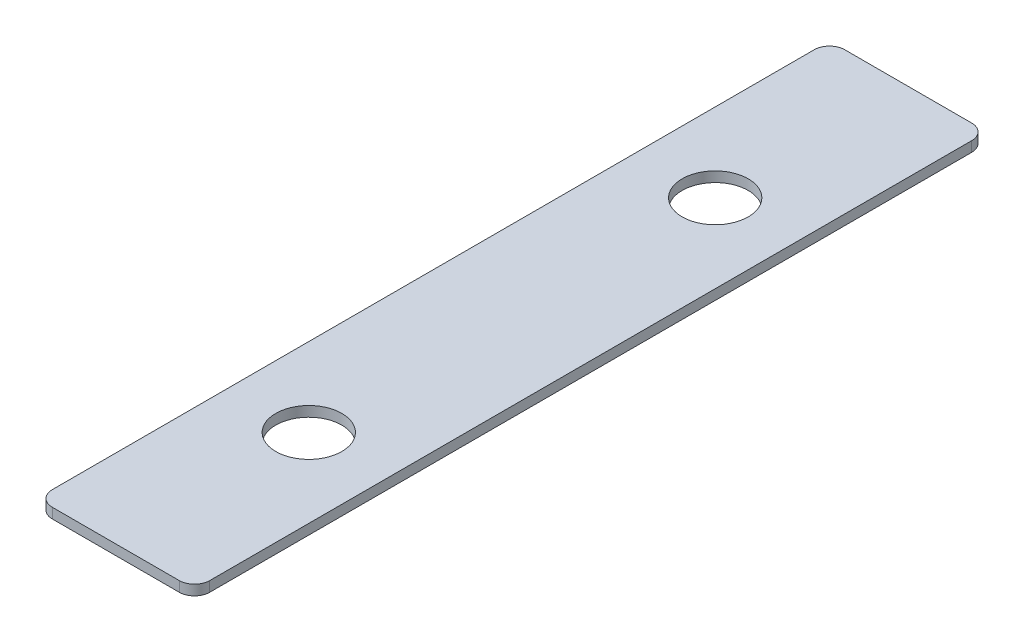
ISO-10303-21;
HEADER;
FILE_DESCRIPTION(('STEP AP214'),'2;1');
FILE_NAME('part.step','',(''),(''),'','','');
FILE_SCHEMA(('AUTOMOTIVE_DESIGN { 1 0 10303 214 1 1 1 1 }'));
ENDSEC;
DATA;
#1=APPLICATION_CONTEXT('core data for automotive mechanical design processes');
#2=APPLICATION_PROTOCOL_DEFINITION('international standard','automotive_design',2000,#1);
#3=PRODUCT_CONTEXT('',#1,'mechanical');
#4=PRODUCT('Part','Part','',(#3));
#5=PRODUCT_RELATED_PRODUCT_CATEGORY('part','',(#4));
#6=PRODUCT_DEFINITION_FORMATION('','',#4);
#7=PRODUCT_DEFINITION_CONTEXT('part definition',#1,'design');
#8=PRODUCT_DEFINITION('design','',#6,#7);
#9=PRODUCT_DEFINITION_SHAPE('','',#8);
#10=(LENGTH_UNIT() NAMED_UNIT(*) SI_UNIT(.MILLI.,.METRE.));
#11=(NAMED_UNIT(*) PLANE_ANGLE_UNIT() SI_UNIT($,.RADIAN.));
#12=(NAMED_UNIT(*) SI_UNIT($,.STERADIAN.) SOLID_ANGLE_UNIT());
#13=UNCERTAINTY_MEASURE_WITH_UNIT(LENGTH_MEASURE(1.E-05),#10,'distance_accuracy_value','');
#14=(GEOMETRIC_REPRESENTATION_CONTEXT(3) GLOBAL_UNCERTAINTY_ASSIGNED_CONTEXT((#13)) GLOBAL_UNIT_ASSIGNED_CONTEXT((#10,
#11,#12)) REPRESENTATION_CONTEXT('',''));
#15=CARTESIAN_POINT('',(0.,0.,0.));
#16=DIRECTION('',(0.,0.,1.));
#17=DIRECTION('',(1.,0.,0.));
#18=AXIS2_PLACEMENT_3D('',#15,#16,#17);
#19=CARTESIAN_POINT('',(-13.,2.,75.5));
#20=DIRECTION('',(0.,1.,0.));
#21=DIRECTION('',(0.,0.,1.));
#22=AXIS2_PLACEMENT_3D('',#19,#20,#21);
#23=PLANE('',#22);
#24=CARTESIAN_POINT('',(-0.500000000000007,2.,-39.5));
#25=DIRECTION('',(0.,1.,0.));
#26=DIRECTION('',(0.,0.,1.));
#27=AXIS2_PLACEMENT_3D('',#24,#25,#26);
#28=CIRCLE('',#27,6.5);
#29=CARTESIAN_POINT('',(-0.500000000000007,2.,-33.));
#30=VERTEX_POINT('',#29);
#31=EDGE_CURVE('E133',#30,#30,#28,.T.);
#32=ORIENTED_EDGE('',*,*,#31,.F.);
#33=EDGE_LOOP('',(#32));
#34=FACE_BOUND('',#33,.T.);
#35=CARTESIAN_POINT('',(-13.,2.,75.5));
#36=DIRECTION('',(0.,1.,0.));
#37=DIRECTION('',(0.,0.,1.));
#38=AXIS2_PLACEMENT_3D('',#35,#36,#37);
#39=CIRCLE('',#38,3.);
#40=CARTESIAN_POINT('',(-16.,2.,75.5));
#41=VERTEX_POINT('',#40);
#42=CARTESIAN_POINT('',(-13.,2.,78.5));
#43=VERTEX_POINT('',#42);
#44=EDGE_CURVE('E144',#41,#43,#39,.T.);
#45=ORIENTED_EDGE('',*,*,#44,.T.);
#46=DIRECTION('',(1.,0.,0.));
#47=VECTOR('',#46,1.);
#48=CARTESIAN_POINT('',(-13.,2.,78.5));
#49=LINE('',#48,#47);
#50=CARTESIAN_POINT('',(12.,2.,78.5));
#51=VERTEX_POINT('',#50);
#52=EDGE_CURVE('E92',#43,#51,#49,.T.);
#53=ORIENTED_EDGE('',*,*,#52,.T.);
#54=CARTESIAN_POINT('',(12.,2.,75.5));
#55=DIRECTION('',(0.,1.,0.));
#56=DIRECTION('',(0.,0.,-1.));
#57=AXIS2_PLACEMENT_3D('',#54,#55,#56);
#58=CIRCLE('',#57,3.);
#59=CARTESIAN_POINT('',(15.,2.,75.5));
#60=VERTEX_POINT('',#59);
#61=EDGE_CURVE('E159',#51,#60,#58,.T.);
#62=ORIENTED_EDGE('',*,*,#61,.T.);
#63=DIRECTION('',(0.,0.,-1.));
#64=VECTOR('',#63,1.);
#65=CARTESIAN_POINT('',(15.,2.,75.5));
#66=LINE('',#65,#64);
#67=CARTESIAN_POINT('',(15.,2.,-74.5));
#68=VERTEX_POINT('',#67);
#69=EDGE_CURVE('E172',#60,#68,#66,.T.);
#70=ORIENTED_EDGE('',*,*,#69,.T.);
#71=CARTESIAN_POINT('',(12.,2.,-74.5));
#72=DIRECTION('',(0.,1.,0.));
#73=DIRECTION('',(0.,0.,-1.));
#74=AXIS2_PLACEMENT_3D('',#71,#72,#73);
#75=CIRCLE('',#74,3.);
#76=CARTESIAN_POINT('',(12.,2.,-77.5));
#77=VERTEX_POINT('',#76);
#78=EDGE_CURVE('E111',#68,#77,#75,.T.);
#79=ORIENTED_EDGE('',*,*,#78,.T.);
#80=DIRECTION('',(-1.,0.,0.));
#81=VECTOR('',#80,1.);
#82=CARTESIAN_POINT('',(-13.,2.,-77.5));
#83=LINE('',#82,#81);
#84=CARTESIAN_POINT('',(-13.,2.,-77.5));
#85=VERTEX_POINT('',#84);
#86=EDGE_CURVE('E105',#77,#85,#83,.T.);
#87=ORIENTED_EDGE('',*,*,#86,.T.);
#88=CARTESIAN_POINT('',(-13.,2.,-74.5));
#89=DIRECTION('',(0.,1.,0.));
#90=DIRECTION('',(0.,0.,-1.));
#91=AXIS2_PLACEMENT_3D('',#88,#89,#90);
#92=CIRCLE('',#91,3.);
#93=CARTESIAN_POINT('',(-16.,2.,-74.5));
#94=VERTEX_POINT('',#93);
#95=EDGE_CURVE('E109',#85,#94,#92,.T.);
#96=ORIENTED_EDGE('',*,*,#95,.T.);
#97=DIRECTION('',(0.,0.,1.));
#98=VECTOR('',#97,1.);
#99=CARTESIAN_POINT('',(-16.,2.,75.5));
#100=LINE('',#99,#98);
#101=EDGE_CURVE('E49',#94,#41,#100,.T.);
#102=ORIENTED_EDGE('',*,*,#101,.T.);
#103=EDGE_LOOP('',(#45,#53,#62,#70,#79,#87,#96,#102));
#104=FACE_BOUND('',#103,.T.);
#105=CARTESIAN_POINT('',(-0.500000000000007,2.,40.5));
#106=DIRECTION('',(0.,1.,0.));
#107=DIRECTION('',(0.,0.,1.));
#108=AXIS2_PLACEMENT_3D('',#105,#106,#107);
#109=CIRCLE('',#108,6.5);
#110=CARTESIAN_POINT('',(-0.500000000000007,2.,47.));
#111=VERTEX_POINT('',#110);
#112=EDGE_CURVE('E181',#111,#111,#109,.T.);
#113=ORIENTED_EDGE('',*,*,#112,.F.);
#114=EDGE_LOOP('',(#113));
#115=FACE_BOUND('',#114,.T.);
#116=ADVANCED_FACE('F32',(#34,#104,#115),#23,.T.);
#117=CARTESIAN_POINT('',(-13.,0.,75.5));
#118=DIRECTION('',(0.,1.,0.));
#119=DIRECTION('',(0.,0.,1.));
#120=AXIS2_PLACEMENT_3D('',#117,#118,#119);
#121=PLANE('',#120);
#122=CARTESIAN_POINT('',(-13.,0.,75.5));
#123=DIRECTION('',(0.,1.,0.));
#124=DIRECTION('',(0.,0.,1.));
#125=AXIS2_PLACEMENT_3D('',#122,#123,#124);
#126=CIRCLE('',#125,3.);
#127=CARTESIAN_POINT('',(-16.,0.,75.5));
#128=VERTEX_POINT('',#127);
#129=CARTESIAN_POINT('',(-13.,0.,78.5));
#130=VERTEX_POINT('',#129);
#131=EDGE_CURVE('E129',#128,#130,#126,.T.);
#132=ORIENTED_EDGE('',*,*,#131,.F.);
#133=DIRECTION('',(0.,0.,1.));
#134=VECTOR('',#133,1.);
#135=CARTESIAN_POINT('',(-16.,0.,75.5));
#136=LINE('',#135,#134);
#137=CARTESIAN_POINT('',(-16.,0.,-74.5));
#138=VERTEX_POINT('',#137);
#139=EDGE_CURVE('E84',#138,#128,#136,.T.);
#140=ORIENTED_EDGE('',*,*,#139,.F.);
#141=CARTESIAN_POINT('',(-13.,0.,-74.5));
#142=DIRECTION('',(0.,1.,0.));
#143=DIRECTION('',(0.,0.,-1.));
#144=AXIS2_PLACEMENT_3D('',#141,#142,#143);
#145=CIRCLE('',#144,3.);
#146=CARTESIAN_POINT('',(-13.,0.,-77.5));
#147=VERTEX_POINT('',#146);
#148=EDGE_CURVE('E78',#147,#138,#145,.T.);
#149=ORIENTED_EDGE('',*,*,#148,.F.);
#150=DIRECTION('',(-1.,0.,0.));
#151=VECTOR('',#150,1.);
#152=CARTESIAN_POINT('',(-13.,0.,-77.5));
#153=LINE('',#152,#151);
#154=CARTESIAN_POINT('',(12.,0.,-77.5));
#155=VERTEX_POINT('',#154);
#156=EDGE_CURVE('E119',#155,#147,#153,.T.);
#157=ORIENTED_EDGE('',*,*,#156,.F.);
#158=CARTESIAN_POINT('',(12.,0.,-74.5));
#159=DIRECTION('',(0.,1.,0.));
#160=DIRECTION('',(0.,0.,-1.));
#161=AXIS2_PLACEMENT_3D('',#158,#159,#160);
#162=CIRCLE('',#161,3.);
#163=CARTESIAN_POINT('',(15.,0.,-74.5));
#164=VERTEX_POINT('',#163);
#165=EDGE_CURVE('E139',#164,#155,#162,.T.);
#166=ORIENTED_EDGE('',*,*,#165,.F.);
#167=DIRECTION('',(0.,0.,-1.));
#168=VECTOR('',#167,1.);
#169=CARTESIAN_POINT('',(15.,0.,75.5));
#170=LINE('',#169,#168);
#171=CARTESIAN_POINT('',(15.,0.,75.5));
#172=VERTEX_POINT('',#171);
#173=EDGE_CURVE('E137',#172,#164,#170,.T.);
#174=ORIENTED_EDGE('',*,*,#173,.F.);
#175=CARTESIAN_POINT('',(12.,0.,75.5));
#176=DIRECTION('',(0.,1.,0.));
#177=DIRECTION('',(0.,0.,-1.));
#178=AXIS2_PLACEMENT_3D('',#175,#176,#177);
#179=CIRCLE('',#178,3.);
#180=CARTESIAN_POINT('',(12.,0.,78.5));
#181=VERTEX_POINT('',#180);
#182=EDGE_CURVE('E135',#181,#172,#179,.T.);
#183=ORIENTED_EDGE('',*,*,#182,.F.);
#184=DIRECTION('',(1.,0.,0.));
#185=VECTOR('',#184,1.);
#186=CARTESIAN_POINT('',(-13.,0.,78.5));
#187=LINE('',#186,#185);
#188=EDGE_CURVE('E132',#130,#181,#187,.T.);
#189=ORIENTED_EDGE('',*,*,#188,.F.);
#190=EDGE_LOOP('',(#132,#140,#149,#157,#166,#174,#183,#189));
#191=FACE_BOUND('',#190,.T.);
#192=CARTESIAN_POINT('',(-0.500000000000007,0.,-39.5));
#193=DIRECTION('',(0.,1.,0.));
#194=DIRECTION('',(0.,0.,1.));
#195=AXIS2_PLACEMENT_3D('',#192,#193,#194);
#196=CIRCLE('',#195,6.5);
#197=CARTESIAN_POINT('',(-0.500000000000007,0.,-33.));
#198=VERTEX_POINT('',#197);
#199=EDGE_CURVE('E178',#198,#198,#196,.T.);
#200=ORIENTED_EDGE('',*,*,#199,.T.);
#201=EDGE_LOOP('',(#200));
#202=FACE_BOUND('',#201,.T.);
#203=CARTESIAN_POINT('',(-0.500000000000007,0.,40.5));
#204=DIRECTION('',(0.,1.,0.));
#205=DIRECTION('',(0.,0.,1.));
#206=AXIS2_PLACEMENT_3D('',#203,#204,#205);
#207=CIRCLE('',#206,6.5);
#208=CARTESIAN_POINT('',(-0.500000000000007,0.,47.));
#209=VERTEX_POINT('',#208);
#210=EDGE_CURVE('E184',#209,#209,#207,.T.);
#211=ORIENTED_EDGE('',*,*,#210,.T.);
#212=EDGE_LOOP('',(#211));
#213=FACE_BOUND('',#212,.T.);
#214=ADVANCED_FACE('F163',(#191,#202,#213),#121,.F.);
#215=CARTESIAN_POINT('',(-13.,2.,75.5));
#216=DIRECTION('',(0.,-1.,0.));
#217=DIRECTION('',(0.,0.,-1.));
#218=AXIS2_PLACEMENT_3D('',#215,#216,#217);
#219=CYLINDRICAL_SURFACE('',#218,3.);
#220=ORIENTED_EDGE('',*,*,#131,.T.);
#221=DIRECTION('',(0.,-1.,0.));
#222=VECTOR('',#221,1.);
#223=CARTESIAN_POINT('',(-13.,2.,78.5));
#224=LINE('',#223,#222);
#225=EDGE_CURVE('E11',#43,#130,#224,.T.);
#226=ORIENTED_EDGE('',*,*,#225,.F.);
#227=ORIENTED_EDGE('',*,*,#44,.F.);
#228=DIRECTION('',(0.,-1.,0.));
#229=VECTOR('',#228,1.);
#230=CARTESIAN_POINT('',(-16.,2.,75.5));
#231=LINE('',#230,#229);
#232=EDGE_CURVE('E125',#41,#128,#231,.T.);
#233=ORIENTED_EDGE('',*,*,#232,.T.);
#234=EDGE_LOOP('',(#220,#226,#227,#233));
#235=FACE_BOUND('',#234,.T.);
#236=ADVANCED_FACE('F34',(#235),#219,.T.);
#237=CARTESIAN_POINT('',(-13.,2.,78.5));
#238=DIRECTION('',(0.,0.,-1.));
#239=DIRECTION('',(-1.,0.,0.));
#240=AXIS2_PLACEMENT_3D('',#237,#238,#239);
#241=PLANE('',#240);
#242=ORIENTED_EDGE('',*,*,#188,.T.);
#243=DIRECTION('',(0.,-1.,0.));
#244=VECTOR('',#243,1.);
#245=CARTESIAN_POINT('',(12.,2.,78.5));
#246=LINE('',#245,#244);
#247=EDGE_CURVE('E41',#51,#181,#246,.T.);
#248=ORIENTED_EDGE('',*,*,#247,.F.);
#249=ORIENTED_EDGE('',*,*,#52,.F.);
#250=ORIENTED_EDGE('',*,*,#225,.T.);
#251=EDGE_LOOP('',(#242,#248,#249,#250));
#252=FACE_BOUND('',#251,.T.);
#253=ADVANCED_FACE('F216',(#252),#241,.F.);
#254=CARTESIAN_POINT('',(12.,2.,75.5));
#255=DIRECTION('',(0.,-1.,0.));
#256=DIRECTION('',(0.,0.,-1.));
#257=AXIS2_PLACEMENT_3D('',#254,#255,#256);
#258=CYLINDRICAL_SURFACE('',#257,3.);
#259=ORIENTED_EDGE('',*,*,#182,.T.);
#260=DIRECTION('',(0.,-1.,0.));
#261=VECTOR('',#260,1.);
#262=CARTESIAN_POINT('',(15.,2.,75.5));
#263=LINE('',#262,#261);
#264=EDGE_CURVE('E151',#60,#172,#263,.T.);
#265=ORIENTED_EDGE('',*,*,#264,.F.);
#266=ORIENTED_EDGE('',*,*,#61,.F.);
#267=ORIENTED_EDGE('',*,*,#247,.T.);
#268=EDGE_LOOP('',(#259,#265,#266,#267));
#269=FACE_BOUND('',#268,.T.);
#270=ADVANCED_FACE('F157',(#269),#258,.T.);
#271=CARTESIAN_POINT('',(15.,2.,75.5));
#272=DIRECTION('',(-1.,0.,0.));
#273=DIRECTION('',(0.,0.,1.));
#274=AXIS2_PLACEMENT_3D('',#271,#272,#273);
#275=PLANE('',#274);
#276=ORIENTED_EDGE('',*,*,#173,.T.);
#277=DIRECTION('',(0.,-1.,0.));
#278=VECTOR('',#277,1.);
#279=CARTESIAN_POINT('',(15.,2.,-74.5));
#280=LINE('',#279,#278);
#281=EDGE_CURVE('E148',#68,#164,#280,.T.);
#282=ORIENTED_EDGE('',*,*,#281,.F.);
#283=ORIENTED_EDGE('',*,*,#69,.F.);
#284=ORIENTED_EDGE('',*,*,#264,.T.);
#285=EDGE_LOOP('',(#276,#282,#283,#284));
#286=FACE_BOUND('',#285,.T.);
#287=ADVANCED_FACE('F168',(#286),#275,.F.);
#288=CARTESIAN_POINT('',(12.,2.,-74.5));
#289=DIRECTION('',(0.,-1.,0.));
#290=DIRECTION('',(0.,0.,-1.));
#291=AXIS2_PLACEMENT_3D('',#288,#289,#290);
#292=CYLINDRICAL_SURFACE('',#291,3.);
#293=ORIENTED_EDGE('',*,*,#165,.T.);
#294=DIRECTION('',(0.,-1.,0.));
#295=VECTOR('',#294,1.);
#296=CARTESIAN_POINT('',(12.,2.,-77.5));
#297=LINE('',#296,#295);
#298=EDGE_CURVE('E120',#77,#155,#297,.T.);
#299=ORIENTED_EDGE('',*,*,#298,.F.);
#300=ORIENTED_EDGE('',*,*,#78,.F.);
#301=ORIENTED_EDGE('',*,*,#281,.T.);
#302=EDGE_LOOP('',(#293,#299,#300,#301));
#303=FACE_BOUND('',#302,.T.);
#304=ADVANCED_FACE('F171',(#303),#292,.T.);
#305=CARTESIAN_POINT('',(-13.,2.,-77.5));
#306=DIRECTION('',(0.,0.,1.));
#307=DIRECTION('',(1.,0.,0.));
#308=AXIS2_PLACEMENT_3D('',#305,#306,#307);
#309=PLANE('',#308);
#310=ORIENTED_EDGE('',*,*,#156,.T.);
#311=DIRECTION('',(0.,-1.,0.));
#312=VECTOR('',#311,1.);
#313=CARTESIAN_POINT('',(-13.,2.,-77.5));
#314=LINE('',#313,#312);
#315=EDGE_CURVE('E116',#85,#147,#314,.T.);
#316=ORIENTED_EDGE('',*,*,#315,.F.);
#317=ORIENTED_EDGE('',*,*,#86,.F.);
#318=ORIENTED_EDGE('',*,*,#298,.T.);
#319=EDGE_LOOP('',(#310,#316,#317,#318));
#320=FACE_BOUND('',#319,.T.);
#321=ADVANCED_FACE('F117',(#320),#309,.F.);
#322=CARTESIAN_POINT('',(-13.,2.,-74.5));
#323=DIRECTION('',(0.,-1.,0.));
#324=DIRECTION('',(0.,0.,-1.));
#325=AXIS2_PLACEMENT_3D('',#322,#323,#324);
#326=CYLINDRICAL_SURFACE('',#325,3.);
#327=ORIENTED_EDGE('',*,*,#148,.T.);
#328=DIRECTION('',(0.,-1.,0.));
#329=VECTOR('',#328,1.);
#330=CARTESIAN_POINT('',(-16.,2.,-74.5));
#331=LINE('',#330,#329);
#332=EDGE_CURVE('E121',#94,#138,#331,.T.);
#333=ORIENTED_EDGE('',*,*,#332,.F.);
#334=ORIENTED_EDGE('',*,*,#95,.F.);
#335=ORIENTED_EDGE('',*,*,#315,.T.);
#336=EDGE_LOOP('',(#327,#333,#334,#335));
#337=FACE_BOUND('',#336,.T.);
#338=ADVANCED_FACE('F123',(#337),#326,.T.);
#339=CARTESIAN_POINT('',(-16.,2.,75.5));
#340=DIRECTION('',(1.,0.,0.));
#341=DIRECTION('',(0.,0.,-1.));
#342=AXIS2_PLACEMENT_3D('',#339,#340,#341);
#343=PLANE('',#342);
#344=ORIENTED_EDGE('',*,*,#139,.T.);
#345=ORIENTED_EDGE('',*,*,#232,.F.);
#346=ORIENTED_EDGE('',*,*,#101,.F.);
#347=ORIENTED_EDGE('',*,*,#332,.T.);
#348=EDGE_LOOP('',(#344,#345,#346,#347));
#349=FACE_BOUND('',#348,.T.);
#350=ADVANCED_FACE('F204',(#349),#343,.F.);
#351=CARTESIAN_POINT('',(-0.500000000000007,2.,-39.5));
#352=DIRECTION('',(0.,-1.,0.));
#353=DIRECTION('',(0.,0.,-1.));
#354=AXIS2_PLACEMENT_3D('',#351,#352,#353);
#355=CYLINDRICAL_SURFACE('',#354,6.5);
#356=ORIENTED_EDGE('',*,*,#31,.T.);
#357=EDGE_LOOP('',(#356));
#358=FACE_BOUND('',#357,.T.);
#359=ORIENTED_EDGE('',*,*,#199,.F.);
#360=EDGE_LOOP('',(#359));
#361=FACE_BOUND('',#360,.T.);
#362=ADVANCED_FACE('F201',(#358,#361),#355,.F.);
#363=CARTESIAN_POINT('',(-0.500000000000007,2.,40.5));
#364=DIRECTION('',(0.,-1.,0.));
#365=DIRECTION('',(0.,0.,-1.));
#366=AXIS2_PLACEMENT_3D('',#363,#364,#365);
#367=CYLINDRICAL_SURFACE('',#366,6.5);
#368=ORIENTED_EDGE('',*,*,#112,.T.);
#369=EDGE_LOOP('',(#368));
#370=FACE_BOUND('',#369,.T.);
#371=ORIENTED_EDGE('',*,*,#210,.F.);
#372=EDGE_LOOP('',(#371));
#373=FACE_BOUND('',#372,.T.);
#374=ADVANCED_FACE('F190',(#370,#373),#367,.F.);
#375=CLOSED_SHELL('',(#116,#214,#236,#253,#270,#287,#304,#321,#338,#350,#362,#374));
#376=MANIFOLD_SOLID_BREP('B2',#375);
#377=ADVANCED_BREP_SHAPE_REPRESENTATION('',(#18,#376),#14);
#378=SHAPE_DEFINITION_REPRESENTATION(#9,#377);
ENDSEC;
END-ISO-10303-21;
